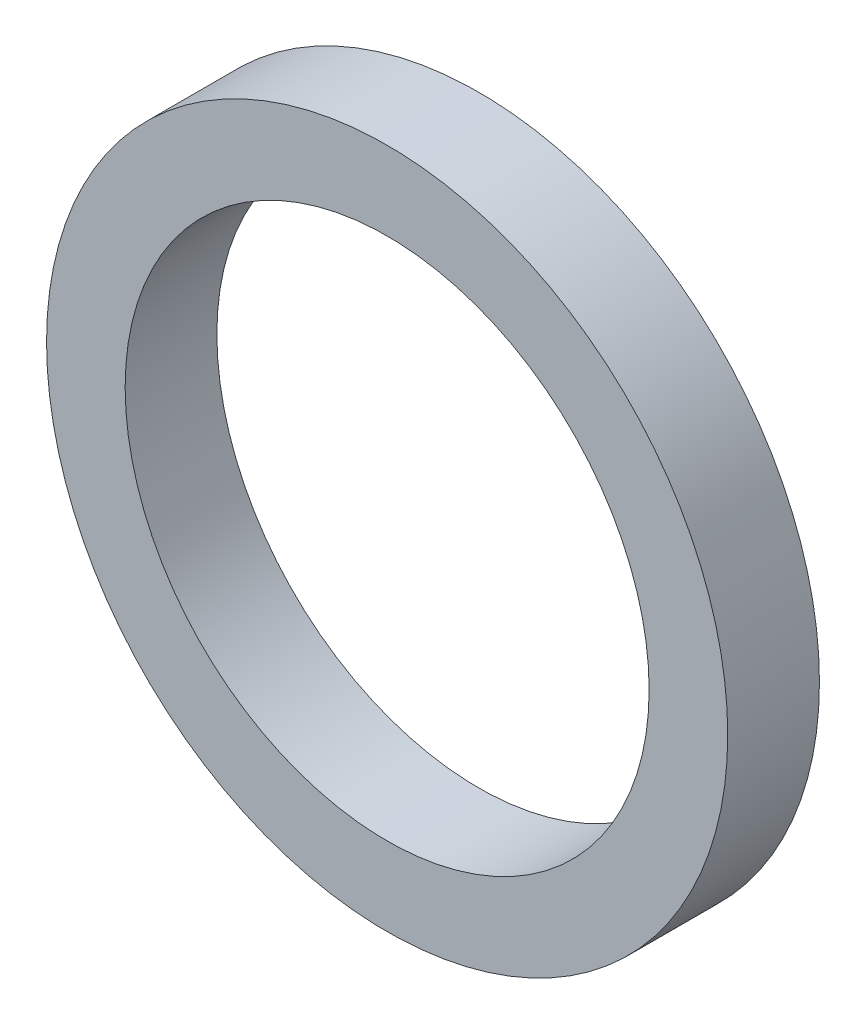
ISO-10303-21;
HEADER;
FILE_DESCRIPTION(('STEP AP214'),'2;1');
FILE_NAME('part.step','',(''),(''),'','','');
FILE_SCHEMA(('AUTOMOTIVE_DESIGN { 1 0 10303 214 1 1 1 1 }'));
ENDSEC;
DATA;
#1=APPLICATION_CONTEXT('core data for automotive mechanical design processes');
#2=APPLICATION_PROTOCOL_DEFINITION('international standard','automotive_design',2000,#1);
#3=PRODUCT_CONTEXT('',#1,'mechanical');
#4=PRODUCT('Part','Part','',(#3));
#5=PRODUCT_RELATED_PRODUCT_CATEGORY('part','',(#4));
#6=PRODUCT_DEFINITION_FORMATION('','',#4);
#7=PRODUCT_DEFINITION_CONTEXT('part definition',#1,'design');
#8=PRODUCT_DEFINITION('design','',#6,#7);
#9=PRODUCT_DEFINITION_SHAPE('','',#8);
#10=(LENGTH_UNIT() NAMED_UNIT(*) SI_UNIT(.MILLI.,.METRE.));
#11=(NAMED_UNIT(*) PLANE_ANGLE_UNIT() SI_UNIT($,.RADIAN.));
#12=(NAMED_UNIT(*) SI_UNIT($,.STERADIAN.) SOLID_ANGLE_UNIT());
#13=UNCERTAINTY_MEASURE_WITH_UNIT(LENGTH_MEASURE(1.E-05),#10,'distance_accuracy_value','');
#14=(GEOMETRIC_REPRESENTATION_CONTEXT(3) GLOBAL_UNCERTAINTY_ASSIGNED_CONTEXT((#13)) GLOBAL_UNIT_ASSIGNED_CONTEXT((#10,
#11,#12)) REPRESENTATION_CONTEXT('',''));
#15=CARTESIAN_POINT('',(0.,0.,0.));
#16=DIRECTION('',(0.,0.,1.));
#17=DIRECTION('',(1.,0.,0.));
#18=AXIS2_PLACEMENT_3D('',#15,#16,#17);
#19=CARTESIAN_POINT('',(0.,0.,7.));
#20=DIRECTION('',(0.,0.,1.));
#21=DIRECTION('',(1.,0.,0.));
#22=AXIS2_PLACEMENT_3D('',#19,#20,#21);
#23=PLANE('',#22);
#24=CARTESIAN_POINT('',(0.,0.,7.));
#25=DIRECTION('',(0.,0.,1.));
#26=DIRECTION('',(1.,0.,0.));
#27=AXIS2_PLACEMENT_3D('',#24,#25,#26);
#28=CIRCLE('',#27,26.);
#29=CARTESIAN_POINT('',(26.,0.,7.));
#30=VERTEX_POINT('',#29);
#31=EDGE_CURVE('E10',#30,#30,#28,.T.);
#32=ORIENTED_EDGE('',*,*,#31,.T.);
#33=EDGE_LOOP('',(#32));
#34=FACE_BOUND('',#33,.T.);
#35=CARTESIAN_POINT('',(0.,0.,7.));
#36=DIRECTION('',(0.,0.,1.));
#37=DIRECTION('',(1.,0.,0.));
#38=AXIS2_PLACEMENT_3D('',#35,#36,#37);
#39=CIRCLE('',#38,20.);
#40=CARTESIAN_POINT('',(20.,0.,7.));
#41=VERTEX_POINT('',#40);
#42=EDGE_CURVE('E49',#41,#41,#39,.T.);
#43=ORIENTED_EDGE('',*,*,#42,.F.);
#44=EDGE_LOOP('',(#43));
#45=FACE_BOUND('',#44,.T.);
#46=ADVANCED_FACE('F39',(#34,#45),#23,.T.);
#47=CARTESIAN_POINT('',(0.,0.,0.));
#48=DIRECTION('',(0.,0.,1.));
#49=DIRECTION('',(1.,0.,0.));
#50=AXIS2_PLACEMENT_3D('',#47,#48,#49);
#51=PLANE('',#50);
#52=CARTESIAN_POINT('',(0.,0.,0.));
#53=DIRECTION('',(0.,0.,1.));
#54=DIRECTION('',(1.,0.,0.));
#55=AXIS2_PLACEMENT_3D('',#52,#53,#54);
#56=CIRCLE('',#55,26.);
#57=CARTESIAN_POINT('',(26.,0.,0.));
#58=VERTEX_POINT('',#57);
#59=EDGE_CURVE('E43',#58,#58,#56,.T.);
#60=ORIENTED_EDGE('',*,*,#59,.F.);
#61=EDGE_LOOP('',(#60));
#62=FACE_BOUND('',#61,.T.);
#63=CARTESIAN_POINT('',(0.,0.,0.));
#64=DIRECTION('',(0.,0.,1.));
#65=DIRECTION('',(1.,0.,0.));
#66=AXIS2_PLACEMENT_3D('',#63,#64,#65);
#67=CIRCLE('',#66,20.);
#68=CARTESIAN_POINT('',(20.,0.,0.));
#69=VERTEX_POINT('',#68);
#70=EDGE_CURVE('E55',#69,#69,#67,.T.);
#71=ORIENTED_EDGE('',*,*,#70,.T.);
#72=EDGE_LOOP('',(#71));
#73=FACE_BOUND('',#72,.T.);
#74=ADVANCED_FACE('F62',(#62,#73),#51,.F.);
#75=CARTESIAN_POINT('',(0.,0.,7.));
#76=DIRECTION('',(0.,0.,-1.));
#77=DIRECTION('',(-1.,0.,0.));
#78=AXIS2_PLACEMENT_3D('',#75,#76,#77);
#79=CYLINDRICAL_SURFACE('',#78,26.);
#80=ORIENTED_EDGE('',*,*,#31,.F.);
#81=EDGE_LOOP('',(#80));
#82=FACE_BOUND('',#81,.T.);
#83=ORIENTED_EDGE('',*,*,#59,.T.);
#84=EDGE_LOOP('',(#83));
#85=FACE_BOUND('',#84,.T.);
#86=ADVANCED_FACE('F41',(#82,#85),#79,.T.);
#87=CARTESIAN_POINT('',(0.,0.,7.));
#88=DIRECTION('',(0.,0.,-1.));
#89=DIRECTION('',(-1.,0.,0.));
#90=AXIS2_PLACEMENT_3D('',#87,#88,#89);
#91=CYLINDRICAL_SURFACE('',#90,20.);
#92=ORIENTED_EDGE('',*,*,#42,.T.);
#93=EDGE_LOOP('',(#92));
#94=FACE_BOUND('',#93,.T.);
#95=ORIENTED_EDGE('',*,*,#70,.F.);
#96=EDGE_LOOP('',(#95));
#97=FACE_BOUND('',#96,.T.);
#98=ADVANCED_FACE('F59',(#94,#97),#91,.F.);
#99=CLOSED_SHELL('',(#46,#74,#86,#98));
#100=MANIFOLD_SOLID_BREP('B2',#99);
#101=ADVANCED_BREP_SHAPE_REPRESENTATION('',(#18,#100),#14);
#102=SHAPE_DEFINITION_REPRESENTATION(#9,#101);
ENDSEC;
END-ISO-10303-21;
